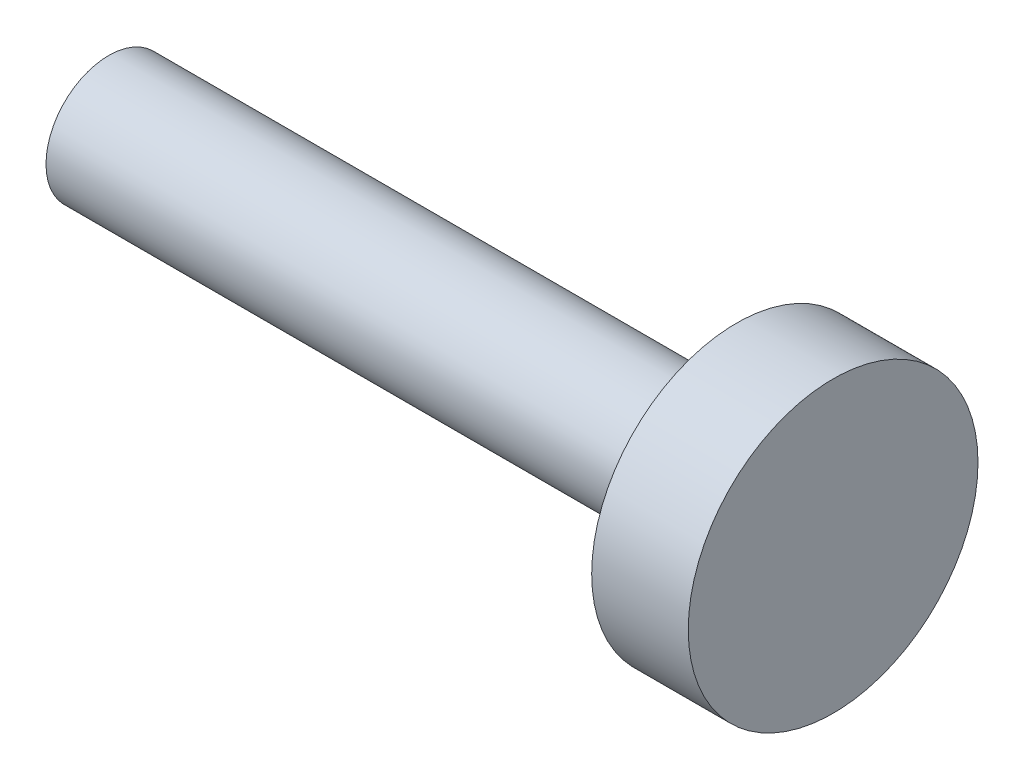
ISO-10303-21;
HEADER;
FILE_DESCRIPTION(('STEP AP214'),'2;1');
FILE_NAME('part.step','',(''),(''),'','','');
FILE_SCHEMA(('AUTOMOTIVE_DESIGN { 1 0 10303 214 1 1 1 1 }'));
ENDSEC;
DATA;
#1=APPLICATION_CONTEXT('core data for automotive mechanical design processes');
#2=APPLICATION_PROTOCOL_DEFINITION('international standard','automotive_design',2000,#1);
#3=PRODUCT_CONTEXT('',#1,'mechanical');
#4=PRODUCT('Part','Part','',(#3));
#5=PRODUCT_RELATED_PRODUCT_CATEGORY('part','',(#4));
#6=PRODUCT_DEFINITION_FORMATION('','',#4);
#7=PRODUCT_DEFINITION_CONTEXT('part definition',#1,'design');
#8=PRODUCT_DEFINITION('design','',#6,#7);
#9=PRODUCT_DEFINITION_SHAPE('','',#8);
#10=(LENGTH_UNIT() NAMED_UNIT(*) SI_UNIT(.MILLI.,.METRE.));
#11=(NAMED_UNIT(*) PLANE_ANGLE_UNIT() SI_UNIT($,.RADIAN.));
#12=(NAMED_UNIT(*) SI_UNIT($,.STERADIAN.) SOLID_ANGLE_UNIT());
#13=UNCERTAINTY_MEASURE_WITH_UNIT(LENGTH_MEASURE(1.E-05),#10,'distance_accuracy_value','');
#14=(GEOMETRIC_REPRESENTATION_CONTEXT(3) GLOBAL_UNCERTAINTY_ASSIGNED_CONTEXT((#13)) GLOBAL_UNIT_ASSIGNED_CONTEXT((#10,
#11,#12)) REPRESENTATION_CONTEXT('',''));
#15=CARTESIAN_POINT('',(0.,0.,0.));
#16=DIRECTION('',(0.,0.,1.));
#17=DIRECTION('',(1.,0.,0.));
#18=AXIS2_PLACEMENT_3D('',#15,#16,#17);
#19=CARTESIAN_POINT('',(-20.5,32.8888888888889,-41.));
#20=DIRECTION('',(-1.,0.,0.));
#21=DIRECTION('',(0.,0.,1.));
#22=AXIS2_PLACEMENT_3D('',#19,#20,#21);
#23=PLANE('',#22);
#24=CARTESIAN_POINT('',(-20.5,32.8888888888889,-41.));
#25=DIRECTION('',(-1.,0.,0.));
#26=DIRECTION('',(0.,0.,1.));
#27=AXIS2_PLACEMENT_3D('',#24,#25,#26);
#28=CIRCLE('',#27,0.64999999999999);
#29=CARTESIAN_POINT('',(-20.5,32.8888888888889,-40.35));
#30=VERTEX_POINT('',#29);
#31=EDGE_CURVE('E10',#30,#30,#28,.T.);
#32=ORIENTED_EDGE('',*,*,#31,.T.);
#33=EDGE_LOOP('',(#32));
#34=FACE_BOUND('',#33,.T.);
#35=ADVANCED_FACE('F31',(#34),#23,.T.);
#36=CARTESIAN_POINT('',(-20.5,32.8888888888889,-41.));
#37=DIRECTION('',(-1.,0.,0.));
#38=DIRECTION('',(0.,0.,1.));
#39=AXIS2_PLACEMENT_3D('',#36,#37,#38);
#40=CYLINDRICAL_SURFACE('',#39,0.64999999999999);
#41=CARTESIAN_POINT('',(-14.,32.8888888888889,-41.));
#42=DIRECTION('',(-1.,0.,0.));
#43=DIRECTION('',(0.,0.,1.));
#44=AXIS2_PLACEMENT_3D('',#41,#42,#43);
#45=CIRCLE('',#44,0.64999999999999);
#46=CARTESIAN_POINT('',(-14.,32.8888888888889,-40.35));
#47=VERTEX_POINT('',#46);
#48=EDGE_CURVE('E37',#47,#47,#45,.T.);
#49=ORIENTED_EDGE('',*,*,#48,.T.);
#50=EDGE_LOOP('',(#49));
#51=FACE_BOUND('',#50,.T.);
#52=ORIENTED_EDGE('',*,*,#31,.F.);
#53=EDGE_LOOP('',(#52));
#54=FACE_BOUND('',#53,.T.);
#55=ADVANCED_FACE('F63',(#51,#54),#40,.T.);
#56=CARTESIAN_POINT('',(-14.,32.8283303993492,-41.6471728280333));
#57=DIRECTION('',(-1.,0.,0.));
#58=DIRECTION('',(0.,0.,1.));
#59=AXIS2_PLACEMENT_3D('',#56,#57,#58);
#60=PLANE('',#59);
#61=CARTESIAN_POINT('',(-14.,32.8888888888889,-41.));
#62=DIRECTION('',(-1.,0.,0.));
#63=DIRECTION('',(0.,0.,1.));
#64=AXIS2_PLACEMENT_3D('',#61,#62,#63);
#65=CIRCLE('',#64,1.49999999999999);
#66=CARTESIAN_POINT('',(-14.,32.8888888888889,-39.5));
#67=VERTEX_POINT('',#66);
#68=EDGE_CURVE('E41',#67,#67,#65,.T.);
#69=ORIENTED_EDGE('',*,*,#68,.T.);
#70=EDGE_LOOP('',(#69));
#71=FACE_BOUND('',#70,.T.);
#72=ORIENTED_EDGE('',*,*,#48,.F.);
#73=EDGE_LOOP('',(#72));
#74=FACE_BOUND('',#73,.T.);
#75=ADVANCED_FACE('F59',(#71,#74),#60,.T.);
#76=CARTESIAN_POINT('',(-20.5,32.8888888888889,-41.));
#77=DIRECTION('',(-1.,0.,0.));
#78=DIRECTION('',(0.,0.,1.));
#79=AXIS2_PLACEMENT_3D('',#76,#77,#78);
#80=CYLINDRICAL_SURFACE('',#79,1.49999999999999);
#81=ORIENTED_EDGE('',*,*,#68,.F.);
#82=EDGE_LOOP('',(#81));
#83=FACE_BOUND('',#82,.T.);
#84=CARTESIAN_POINT('',(-13.,32.8888888888889,-41.));
#85=DIRECTION('',(-1.,0.,0.));
#86=DIRECTION('',(0.,0.,1.));
#87=AXIS2_PLACEMENT_3D('',#84,#85,#86);
#88=CIRCLE('',#87,1.49999999999999);
#89=CARTESIAN_POINT('',(-13.,32.8888888888889,-39.5));
#90=VERTEX_POINT('',#89);
#91=EDGE_CURVE('E45',#90,#90,#88,.T.);
#92=ORIENTED_EDGE('',*,*,#91,.T.);
#93=EDGE_LOOP('',(#92));
#94=FACE_BOUND('',#93,.T.);
#95=ADVANCED_FACE('F51',(#83,#94),#80,.T.);
#96=CARTESIAN_POINT('',(-13.,32.8888888888889,-41.));
#97=DIRECTION('',(-1.,0.,0.));
#98=DIRECTION('',(0.,0.,1.));
#99=AXIS2_PLACEMENT_3D('',#96,#97,#98);
#100=PLANE('',#99);
#101=ORIENTED_EDGE('',*,*,#91,.F.);
#102=EDGE_LOOP('',(#101));
#103=FACE_BOUND('',#102,.T.);
#104=ADVANCED_FACE('F53',(#103),#100,.F.);
#105=CLOSED_SHELL('',(#35,#55,#75,#95,#104));
#106=MANIFOLD_SOLID_BREP('B2',#105);
#107=ADVANCED_BREP_SHAPE_REPRESENTATION('',(#18,#106),#14);
#108=SHAPE_DEFINITION_REPRESENTATION(#9,#107);
ENDSEC;
END-ISO-10303-21;
